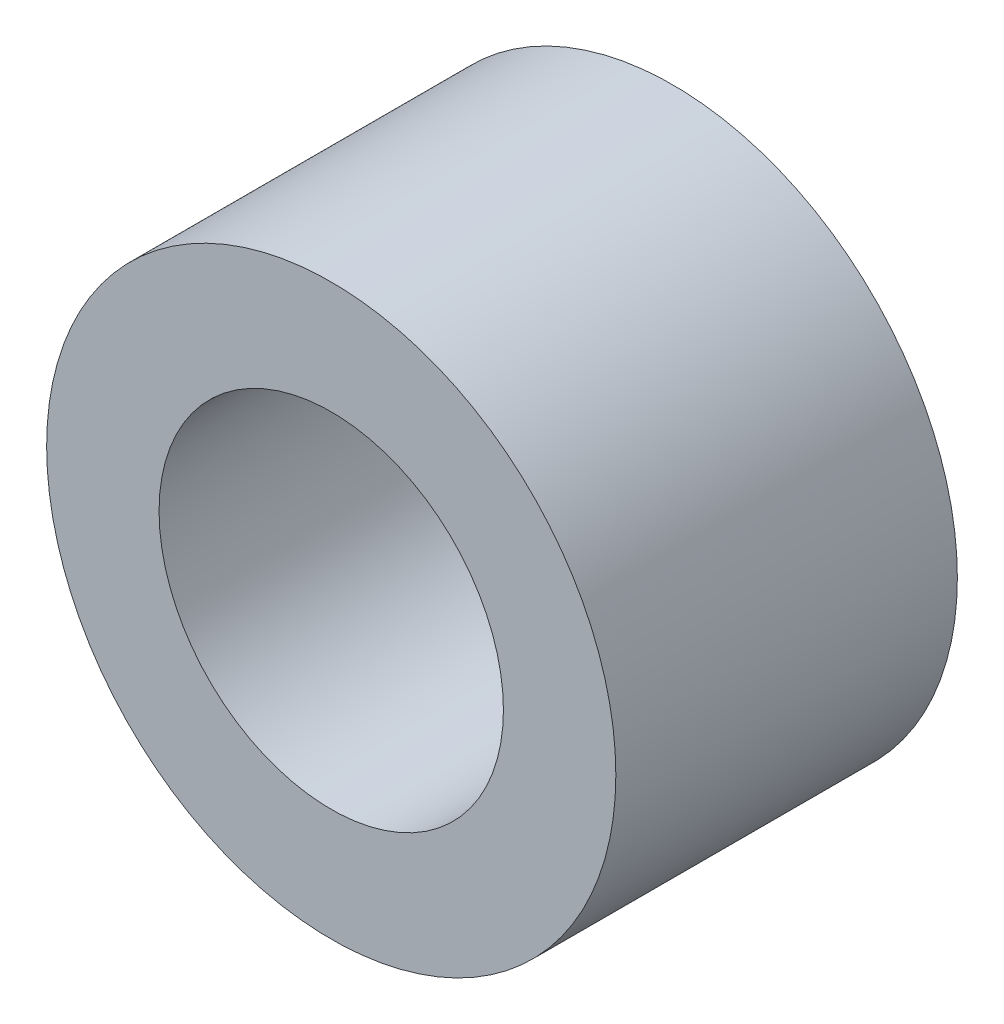
ISO-10303-21;
HEADER;
FILE_DESCRIPTION(('STEP AP214'),'2;1');
FILE_NAME('part.step','',(''),(''),'','','');
FILE_SCHEMA(('AUTOMOTIVE_DESIGN { 1 0 10303 214 1 1 1 1 }'));
ENDSEC;
DATA;
#1=APPLICATION_CONTEXT('core data for automotive mechanical design processes');
#2=APPLICATION_PROTOCOL_DEFINITION('international standard','automotive_design',2000,#1);
#3=PRODUCT_CONTEXT('',#1,'mechanical');
#4=PRODUCT('Part','Part','',(#3));
#5=PRODUCT_RELATED_PRODUCT_CATEGORY('part','',(#4));
#6=PRODUCT_DEFINITION_FORMATION('','',#4);
#7=PRODUCT_DEFINITION_CONTEXT('part definition',#1,'design');
#8=PRODUCT_DEFINITION('design','',#6,#7);
#9=PRODUCT_DEFINITION_SHAPE('','',#8);
#10=(LENGTH_UNIT() NAMED_UNIT(*) SI_UNIT(.MILLI.,.METRE.));
#11=(NAMED_UNIT(*) PLANE_ANGLE_UNIT() SI_UNIT($,.RADIAN.));
#12=(NAMED_UNIT(*) SI_UNIT($,.STERADIAN.) SOLID_ANGLE_UNIT());
#13=UNCERTAINTY_MEASURE_WITH_UNIT(LENGTH_MEASURE(1.E-05),#10,'distance_accuracy_value','');
#14=(GEOMETRIC_REPRESENTATION_CONTEXT(3) GLOBAL_UNCERTAINTY_ASSIGNED_CONTEXT((#13)) GLOBAL_UNIT_ASSIGNED_CONTEXT((#10,
#11,#12)) REPRESENTATION_CONTEXT('',''));
#15=CARTESIAN_POINT('',(0.,0.,0.));
#16=DIRECTION('',(0.,0.,1.));
#17=DIRECTION('',(1.,0.,0.));
#18=AXIS2_PLACEMENT_3D('',#15,#16,#17);
#19=CARTESIAN_POINT('',(0.,0.,6.));
#20=DIRECTION('',(0.,0.,-1.));
#21=DIRECTION('',(-1.,0.,0.));
#22=AXIS2_PLACEMENT_3D('',#19,#20,#21);
#23=CYLINDRICAL_SURFACE('',#22,5.);
#24=CARTESIAN_POINT('',(0.,0.,6.));
#25=DIRECTION('',(0.,0.,1.));
#26=DIRECTION('',(1.,0.,0.));
#27=AXIS2_PLACEMENT_3D('',#24,#25,#26);
#28=CIRCLE('',#27,5.);
#29=CARTESIAN_POINT('',(5.,0.,6.));
#30=VERTEX_POINT('',#29);
#31=EDGE_CURVE('E10',#30,#30,#28,.T.);
#32=ORIENTED_EDGE('',*,*,#31,.F.);
#33=EDGE_LOOP('',(#32));
#34=FACE_BOUND('',#33,.T.);
#35=CARTESIAN_POINT('',(0.,0.,0.));
#36=DIRECTION('',(0.,0.,1.));
#37=DIRECTION('',(1.,0.,0.));
#38=AXIS2_PLACEMENT_3D('',#35,#36,#37);
#39=CIRCLE('',#38,5.);
#40=CARTESIAN_POINT('',(5.,0.,0.));
#41=VERTEX_POINT('',#40);
#42=EDGE_CURVE('E42',#41,#41,#39,.T.);
#43=ORIENTED_EDGE('',*,*,#42,.T.);
#44=EDGE_LOOP('',(#43));
#45=FACE_BOUND('',#44,.T.);
#46=ADVANCED_FACE('F39',(#34,#45),#23,.T.);
#47=CARTESIAN_POINT('',(0.,0.,6.));
#48=DIRECTION('',(0.,0.,1.));
#49=DIRECTION('',(1.,0.,0.));
#50=AXIS2_PLACEMENT_3D('',#47,#48,#49);
#51=PLANE('',#50);
#52=CARTESIAN_POINT('',(0.,0.,6.));
#53=DIRECTION('',(0.,0.,1.));
#54=DIRECTION('',(1.,0.,0.));
#55=AXIS2_PLACEMENT_3D('',#52,#53,#54);
#56=CIRCLE('',#55,3.025);
#57=CARTESIAN_POINT('',(3.025,0.,6.));
#58=VERTEX_POINT('',#57);
#59=EDGE_CURVE('E51',#58,#58,#56,.T.);
#60=ORIENTED_EDGE('',*,*,#59,.F.);
#61=EDGE_LOOP('',(#60));
#62=FACE_BOUND('',#61,.T.);
#63=ORIENTED_EDGE('',*,*,#31,.T.);
#64=EDGE_LOOP('',(#63));
#65=FACE_BOUND('',#64,.T.);
#66=ADVANCED_FACE('F66',(#62,#65),#51,.T.);
#67=CARTESIAN_POINT('',(0.,0.,0.));
#68=DIRECTION('',(0.,0.,1.));
#69=DIRECTION('',(1.,0.,0.));
#70=AXIS2_PLACEMENT_3D('',#67,#68,#69);
#71=PLANE('',#70);
#72=ORIENTED_EDGE('',*,*,#42,.F.);
#73=EDGE_LOOP('',(#72));
#74=FACE_BOUND('',#73,.T.);
#75=ADVANCED_FACE('F62',(#74),#71,.F.);
#76=CARTESIAN_POINT('',(0.,0.,0.5));
#77=DIRECTION('',(0.,0.,1.));
#78=DIRECTION('',(1.,0.,0.));
#79=AXIS2_PLACEMENT_3D('',#76,#77,#78);
#80=CYLINDRICAL_SURFACE('',#79,3.025);
#81=CARTESIAN_POINT('',(0.,0.,0.5));
#82=DIRECTION('',(0.,0.,1.));
#83=DIRECTION('',(1.,0.,0.));
#84=AXIS2_PLACEMENT_3D('',#81,#82,#83);
#85=CIRCLE('',#84,3.025);
#86=CARTESIAN_POINT('',(3.025,0.,0.5));
#87=VERTEX_POINT('',#86);
#88=EDGE_CURVE('E49',#87,#87,#85,.T.);
#89=ORIENTED_EDGE('',*,*,#88,.F.);
#90=EDGE_LOOP('',(#89));
#91=FACE_BOUND('',#90,.T.);
#92=ORIENTED_EDGE('',*,*,#59,.T.);
#93=EDGE_LOOP('',(#92));
#94=FACE_BOUND('',#93,.T.);
#95=ADVANCED_FACE('F59',(#91,#94),#80,.F.);
#96=CARTESIAN_POINT('',(0.,0.,0.5));
#97=DIRECTION('',(0.,0.,1.));
#98=DIRECTION('',(1.,0.,0.));
#99=AXIS2_PLACEMENT_3D('',#96,#97,#98);
#100=PLANE('',#99);
#101=ORIENTED_EDGE('',*,*,#88,.T.);
#102=EDGE_LOOP('',(#101));
#103=FACE_BOUND('',#102,.T.);
#104=ADVANCED_FACE('F57',(#103),#100,.T.);
#105=CLOSED_SHELL('',(#46,#66,#75,#95,#104));
#106=MANIFOLD_SOLID_BREP('B2',#105);
#107=ADVANCED_BREP_SHAPE_REPRESENTATION('',(#18,#106),#14);
#108=SHAPE_DEFINITION_REPRESENTATION(#9,#107);
ENDSEC;
END-ISO-10303-21;
